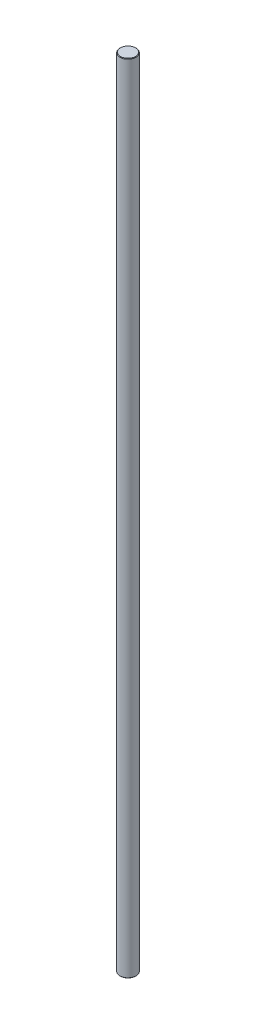
ISO-10303-21;
HEADER;
FILE_DESCRIPTION(('STEP AP214'),'2;1');
FILE_NAME('part.step','',(''),(''),'','','');
FILE_SCHEMA(('AUTOMOTIVE_DESIGN { 1 0 10303 214 1 1 1 1 }'));
ENDSEC;
DATA;
#1=APPLICATION_CONTEXT('core data for automotive mechanical design processes');
#2=APPLICATION_PROTOCOL_DEFINITION('international standard','automotive_design',2000,#1);
#3=PRODUCT_CONTEXT('',#1,'mechanical');
#4=PRODUCT('Part','Part','',(#3));
#5=PRODUCT_RELATED_PRODUCT_CATEGORY('part','',(#4));
#6=PRODUCT_DEFINITION_FORMATION('','',#4);
#7=PRODUCT_DEFINITION_CONTEXT('part definition',#1,'design');
#8=PRODUCT_DEFINITION('design','',#6,#7);
#9=PRODUCT_DEFINITION_SHAPE('','',#8);
#10=(LENGTH_UNIT() NAMED_UNIT(*) SI_UNIT(.MILLI.,.METRE.));
#11=(NAMED_UNIT(*) PLANE_ANGLE_UNIT() SI_UNIT($,.RADIAN.));
#12=(NAMED_UNIT(*) SI_UNIT($,.STERADIAN.) SOLID_ANGLE_UNIT());
#13=UNCERTAINTY_MEASURE_WITH_UNIT(LENGTH_MEASURE(1.E-05),#10,'distance_accuracy_value','');
#14=(GEOMETRIC_REPRESENTATION_CONTEXT(3) GLOBAL_UNCERTAINTY_ASSIGNED_CONTEXT((#13)) GLOBAL_UNIT_ASSIGNED_CONTEXT((#10,
#11,#12)) REPRESENTATION_CONTEXT('',''));
#15=CARTESIAN_POINT('',(0.,0.,0.));
#16=DIRECTION('',(0.,0.,1.));
#17=DIRECTION('',(1.,0.,0.));
#18=AXIS2_PLACEMENT_3D('',#15,#16,#17);
#19=CARTESIAN_POINT('',(-19.4218067225362,398.,-6.00759275739468));
#20=DIRECTION('',(0.,-1.,0.));
#21=DIRECTION('',(0.,0.,-1.));
#22=AXIS2_PLACEMENT_3D('',#19,#20,#21);
#23=CYLINDRICAL_SURFACE('',#22,4.);
#24=CARTESIAN_POINT('',(-19.4218067225362,397.75,-6.00759275739468));
#25=DIRECTION('',(0.,1.,0.));
#26=DIRECTION('',(0.,0.,1.));
#27=AXIS2_PLACEMENT_3D('',#24,#25,#26);
#28=CIRCLE('',#27,4.);
#29=CARTESIAN_POINT('',(-19.4218067225362,397.75,-2.00759275739468));
#30=VERTEX_POINT('',#29);
#31=EDGE_CURVE('E38',#30,#30,#28,.F.);
#32=ORIENTED_EDGE('',*,*,#31,.T.);
#33=EDGE_LOOP('',(#32));
#34=FACE_BOUND('',#33,.T.);
#35=CARTESIAN_POINT('',(-19.4218067225362,0.250000000000139,-6.00759275739468));
#36=DIRECTION('',(0.,1.,0.));
#37=DIRECTION('',(0.,0.,1.));
#38=AXIS2_PLACEMENT_3D('',#35,#36,#37);
#39=CIRCLE('',#38,4.);
#40=CARTESIAN_POINT('',(-19.4218067225362,0.250000000000139,-2.00759275739468));
#41=VERTEX_POINT('',#40);
#42=EDGE_CURVE('E42',#41,#41,#39,.T.);
#43=ORIENTED_EDGE('',*,*,#42,.T.);
#44=EDGE_LOOP('',(#43));
#45=FACE_BOUND('',#44,.T.);
#46=ADVANCED_FACE('F31',(#34,#45),#23,.T.);
#47=CARTESIAN_POINT('',(-19.4218067225362,398.,-6.00759275739468));
#48=DIRECTION('',(0.,1.,0.));
#49=DIRECTION('',(0.,0.,1.));
#50=AXIS2_PLACEMENT_3D('',#47,#48,#49);
#51=PLANE('',#50);
#52=CARTESIAN_POINT('',(-19.4218067225362,398.,-6.00759275739468));
#53=DIRECTION('',(0.,1.,0.));
#54=DIRECTION('',(0.,0.,1.));
#55=AXIS2_PLACEMENT_3D('',#52,#53,#54);
#56=CIRCLE('',#55,3.74999999999998);
#57=CARTESIAN_POINT('',(-19.4218067225362,398.,-2.2575927573947));
#58=VERTEX_POINT('',#57);
#59=EDGE_CURVE('E46',#58,#58,#56,.T.);
#60=ORIENTED_EDGE('',*,*,#59,.T.);
#61=EDGE_LOOP('',(#60));
#62=FACE_BOUND('',#61,.T.);
#63=ADVANCED_FACE('F52',(#62),#51,.T.);
#64=CARTESIAN_POINT('',(-19.4218067225362,0.,-6.00759275739468));
#65=DIRECTION('',(0.,1.,0.));
#66=DIRECTION('',(0.,0.,1.));
#67=AXIS2_PLACEMENT_3D('',#64,#65,#66);
#68=PLANE('',#67);
#69=CARTESIAN_POINT('',(-19.4218067225362,0.,-6.00759275739468));
#70=DIRECTION('',(0.,1.,0.));
#71=DIRECTION('',(0.,0.,1.));
#72=AXIS2_PLACEMENT_3D('',#69,#70,#71);
#73=CIRCLE('',#72,3.74999999999992);
#74=CARTESIAN_POINT('',(-19.4218067225362,0.,-2.25759275739476));
#75=VERTEX_POINT('',#74);
#76=EDGE_CURVE('E10',#75,#75,#73,.F.);
#77=ORIENTED_EDGE('',*,*,#76,.T.);
#78=EDGE_LOOP('',(#77));
#79=FACE_BOUND('',#78,.T.);
#80=ADVANCED_FACE('F56',(#79),#68,.F.);
#81=CARTESIAN_POINT('',(-19.4218067225362,398.,-6.00759275739468));
#82=DIRECTION('',(0.,-1.,0.));
#83=DIRECTION('',(0.,0.,-1.));
#84=AXIS2_PLACEMENT_3D('',#81,#82,#83);
#85=CONICAL_SURFACE('',#84,3.74999999999998,0.785398163397443);
#86=ORIENTED_EDGE('',*,*,#31,.F.);
#87=EDGE_LOOP('',(#86));
#88=FACE_BOUND('',#87,.T.);
#89=ORIENTED_EDGE('',*,*,#59,.F.);
#90=EDGE_LOOP('',(#89));
#91=FACE_BOUND('',#90,.T.);
#92=ADVANCED_FACE('F54',(#88,#91),#85,.T.);
#93=CARTESIAN_POINT('',(-19.4218067225362,0.250000000000139,-6.00759275739468));
#94=DIRECTION('',(0.,1.,0.));
#95=DIRECTION('',(0.,0.,1.));
#96=AXIS2_PLACEMENT_3D('',#93,#94,#95);
#97=CONICAL_SURFACE('',#96,4.,0.785398163397332);
#98=ORIENTED_EDGE('',*,*,#76,.F.);
#99=EDGE_LOOP('',(#98));
#100=FACE_BOUND('',#99,.T.);
#101=ORIENTED_EDGE('',*,*,#42,.F.);
#102=EDGE_LOOP('',(#101));
#103=FACE_BOUND('',#102,.T.);
#104=ADVANCED_FACE('F33',(#100,#103),#97,.T.);
#105=CLOSED_SHELL('',(#46,#63,#80,#92,#104));
#106=MANIFOLD_SOLID_BREP('B2',#105);
#107=ADVANCED_BREP_SHAPE_REPRESENTATION('',(#18,#106),#14);
#108=SHAPE_DEFINITION_REPRESENTATION(#9,#107);
ENDSEC;
END-ISO-10303-21;
